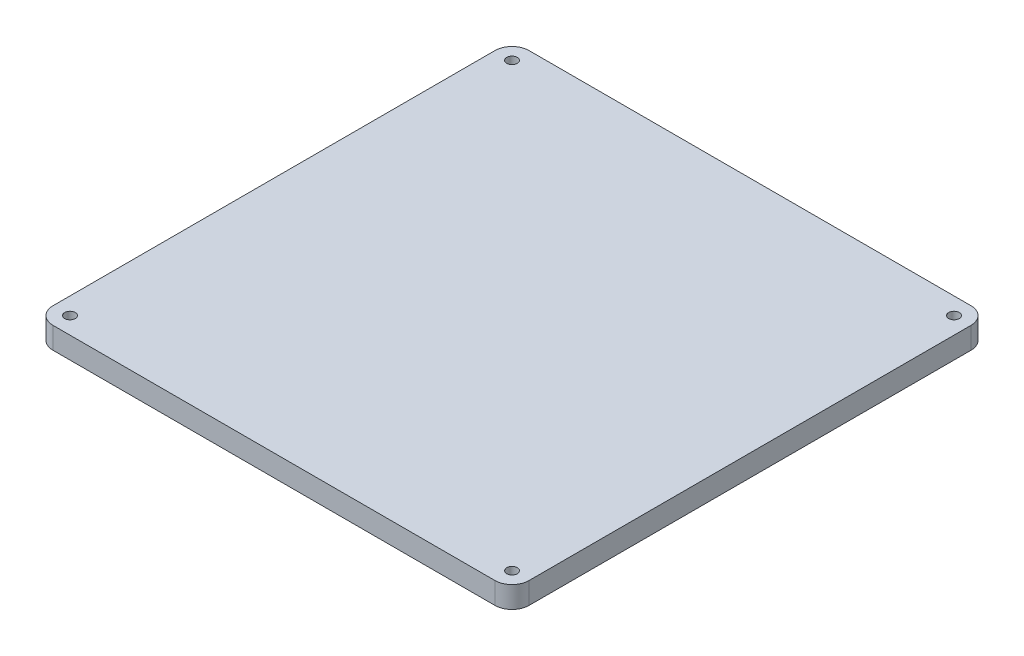
ISO-10303-21;
HEADER;
FILE_DESCRIPTION(('STEP AP214'),'2;1');
FILE_NAME('part.step','',(''),(''),'','','');
FILE_SCHEMA(('AUTOMOTIVE_DESIGN { 1 0 10303 214 1 1 1 1 }'));
ENDSEC;
DATA;
#1=APPLICATION_CONTEXT('core data for automotive mechanical design processes');
#2=APPLICATION_PROTOCOL_DEFINITION('international standard','automotive_design',2000,#1);
#3=PRODUCT_CONTEXT('',#1,'mechanical');
#4=PRODUCT('Part','Part','',(#3));
#5=PRODUCT_RELATED_PRODUCT_CATEGORY('part','',(#4));
#6=PRODUCT_DEFINITION_FORMATION('','',#4);
#7=PRODUCT_DEFINITION_CONTEXT('part definition',#1,'design');
#8=PRODUCT_DEFINITION('design','',#6,#7);
#9=PRODUCT_DEFINITION_SHAPE('','',#8);
#10=(LENGTH_UNIT() NAMED_UNIT(*) SI_UNIT(.MILLI.,.METRE.));
#11=(NAMED_UNIT(*) PLANE_ANGLE_UNIT() SI_UNIT($,.RADIAN.));
#12=(NAMED_UNIT(*) SI_UNIT($,.STERADIAN.) SOLID_ANGLE_UNIT());
#13=UNCERTAINTY_MEASURE_WITH_UNIT(LENGTH_MEASURE(1.E-05),#10,'distance_accuracy_value','');
#14=(GEOMETRIC_REPRESENTATION_CONTEXT(3) GLOBAL_UNCERTAINTY_ASSIGNED_CONTEXT((#13)) GLOBAL_UNIT_ASSIGNED_CONTEXT((#10,
#11,#12)) REPRESENTATION_CONTEXT('',''));
#15=CARTESIAN_POINT('',(0.,0.,0.));
#16=DIRECTION('',(0.,0.,1.));
#17=DIRECTION('',(1.,0.,0.));
#18=AXIS2_PLACEMENT_3D('',#15,#16,#17);
#19=CARTESIAN_POINT('',(-70.,6.35,70.));
#20=DIRECTION('',(1.,0.,0.));
#21=DIRECTION('',(0.,0.,-1.));
#22=AXIS2_PLACEMENT_3D('',#19,#20,#21);
#23=PLANE('',#22);
#24=DIRECTION('',(0.,0.,1.));
#25=VECTOR('',#24,1.);
#26=CARTESIAN_POINT('',(-70.,6.35,70.));
#27=LINE('',#26,#25);
#28=CARTESIAN_POINT('',(-70.,6.35,-65.));
#29=VERTEX_POINT('',#28);
#30=CARTESIAN_POINT('',(-70.,6.35,65.));
#31=VERTEX_POINT('',#30);
#32=EDGE_CURVE('E118',#29,#31,#27,.T.);
#33=ORIENTED_EDGE('',*,*,#32,.F.);
#34=DIRECTION('',(0.,-1.,0.));
#35=VECTOR('',#34,1.);
#36=CARTESIAN_POINT('',(-70.,6.35,-65.));
#37=LINE('',#36,#35);
#38=CARTESIAN_POINT('',(-70.,0.,-65.));
#39=VERTEX_POINT('',#38);
#40=EDGE_CURVE('E103',#29,#39,#37,.T.);
#41=ORIENTED_EDGE('',*,*,#40,.T.);
#42=DIRECTION('',(0.,0.,1.));
#43=VECTOR('',#42,1.);
#44=CARTESIAN_POINT('',(-70.,0.,70.));
#45=LINE('',#44,#43);
#46=CARTESIAN_POINT('',(-70.,0.,65.));
#47=VERTEX_POINT('',#46);
#48=EDGE_CURVE('E115',#39,#47,#45,.T.);
#49=ORIENTED_EDGE('',*,*,#48,.T.);
#50=DIRECTION('',(0.,-1.,0.));
#51=VECTOR('',#50,1.);
#52=CARTESIAN_POINT('',(-70.,6.35,65.));
#53=LINE('',#52,#51);
#54=EDGE_CURVE('E120',#47,#31,#53,.F.);
#55=ORIENTED_EDGE('',*,*,#54,.T.);
#56=EDGE_LOOP('',(#33,#41,#49,#55));
#57=FACE_BOUND('',#56,.T.);
#58=ADVANCED_FACE('F33',(#57),#23,.F.);
#59=CARTESIAN_POINT('',(70.,6.35,70.));
#60=DIRECTION('',(0.,0.,-1.));
#61=DIRECTION('',(-1.,0.,0.));
#62=AXIS2_PLACEMENT_3D('',#59,#60,#61);
#63=PLANE('',#62);
#64=DIRECTION('',(1.,0.,0.));
#65=VECTOR('',#64,1.);
#66=CARTESIAN_POINT('',(70.,0.,70.));
#67=LINE('',#66,#65);
#68=CARTESIAN_POINT('',(-65.,0.,70.));
#69=VERTEX_POINT('',#68);
#70=CARTESIAN_POINT('',(65.,0.,70.));
#71=VERTEX_POINT('',#70);
#72=EDGE_CURVE('E124',#69,#71,#67,.T.);
#73=ORIENTED_EDGE('',*,*,#72,.T.);
#74=DIRECTION('',(0.,-1.,0.));
#75=VECTOR('',#74,1.);
#76=CARTESIAN_POINT('',(65.,6.35,70.));
#77=LINE('',#76,#75);
#78=CARTESIAN_POINT('',(65.,6.35,70.));
#79=VERTEX_POINT('',#78);
#80=EDGE_CURVE('E11',#71,#79,#77,.F.);
#81=ORIENTED_EDGE('',*,*,#80,.T.);
#82=DIRECTION('',(1.,0.,0.));
#83=VECTOR('',#82,1.);
#84=CARTESIAN_POINT('',(70.,6.35,70.));
#85=LINE('',#84,#83);
#86=CARTESIAN_POINT('',(-65.,6.35,70.));
#87=VERTEX_POINT('',#86);
#88=EDGE_CURVE('E164',#87,#79,#85,.T.);
#89=ORIENTED_EDGE('',*,*,#88,.F.);
#90=DIRECTION('',(0.,-1.,0.));
#91=VECTOR('',#90,1.);
#92=CARTESIAN_POINT('',(-65.,6.35,70.));
#93=LINE('',#92,#91);
#94=EDGE_CURVE('E41',#87,#69,#93,.T.);
#95=ORIENTED_EDGE('',*,*,#94,.T.);
#96=EDGE_LOOP('',(#73,#81,#89,#95));
#97=FACE_BOUND('',#96,.T.);
#98=ADVANCED_FACE('F162',(#97),#63,.F.);
#99=CARTESIAN_POINT('',(70.,6.35,70.));
#100=DIRECTION('',(-1.,0.,0.));
#101=DIRECTION('',(0.,0.,1.));
#102=AXIS2_PLACEMENT_3D('',#99,#100,#101);
#103=PLANE('',#102);
#104=DIRECTION('',(0.,0.,-1.));
#105=VECTOR('',#104,1.);
#106=CARTESIAN_POINT('',(70.,0.,70.));
#107=LINE('',#106,#105);
#108=CARTESIAN_POINT('',(70.,0.,65.));
#109=VERTEX_POINT('',#108);
#110=CARTESIAN_POINT('',(70.,0.,-65.));
#111=VERTEX_POINT('',#110);
#112=EDGE_CURVE('E128',#109,#111,#107,.T.);
#113=ORIENTED_EDGE('',*,*,#112,.T.);
#114=DIRECTION('',(0.,-1.,0.));
#115=VECTOR('',#114,1.);
#116=CARTESIAN_POINT('',(70.,6.35,-65.));
#117=LINE('',#116,#115);
#118=CARTESIAN_POINT('',(70.,6.35,-65.));
#119=VERTEX_POINT('',#118);
#120=EDGE_CURVE('E48',#111,#119,#117,.F.);
#121=ORIENTED_EDGE('',*,*,#120,.T.);
#122=DIRECTION('',(0.,0.,-1.));
#123=VECTOR('',#122,1.);
#124=CARTESIAN_POINT('',(70.,6.35,70.));
#125=LINE('',#124,#123);
#126=CARTESIAN_POINT('',(70.,6.35,65.));
#127=VERTEX_POINT('',#126);
#128=EDGE_CURVE('E172',#127,#119,#125,.T.);
#129=ORIENTED_EDGE('',*,*,#128,.F.);
#130=DIRECTION('',(0.,-1.,0.));
#131=VECTOR('',#130,1.);
#132=CARTESIAN_POINT('',(70.,6.35,65.));
#133=LINE('',#132,#131);
#134=EDGE_CURVE('E155',#127,#109,#133,.T.);
#135=ORIENTED_EDGE('',*,*,#134,.T.);
#136=EDGE_LOOP('',(#113,#121,#129,#135));
#137=FACE_BOUND('',#136,.T.);
#138=ADVANCED_FACE('F171',(#137),#103,.F.);
#139=CARTESIAN_POINT('',(70.,6.35,-70.));
#140=DIRECTION('',(0.,0.,1.));
#141=DIRECTION('',(1.,0.,0.));
#142=AXIS2_PLACEMENT_3D('',#139,#140,#141);
#143=PLANE('',#142);
#144=DIRECTION('',(-1.,0.,0.));
#145=VECTOR('',#144,1.);
#146=CARTESIAN_POINT('',(70.,0.,-70.));
#147=LINE('',#146,#145);
#148=CARTESIAN_POINT('',(65.,0.,-70.));
#149=VERTEX_POINT('',#148);
#150=CARTESIAN_POINT('',(-65.,0.,-70.));
#151=VERTEX_POINT('',#150);
#152=EDGE_CURVE('E138',#149,#151,#147,.T.);
#153=ORIENTED_EDGE('',*,*,#152,.T.);
#154=DIRECTION('',(0.,-1.,0.));
#155=VECTOR('',#154,1.);
#156=CARTESIAN_POINT('',(-65.,6.35,-70.));
#157=LINE('',#156,#155);
#158=CARTESIAN_POINT('',(-65.,6.35,-70.));
#159=VERTEX_POINT('',#158);
#160=EDGE_CURVE('E104',#151,#159,#157,.F.);
#161=ORIENTED_EDGE('',*,*,#160,.T.);
#162=DIRECTION('',(-1.,0.,0.));
#163=VECTOR('',#162,1.);
#164=CARTESIAN_POINT('',(70.,6.35,-70.));
#165=LINE('',#164,#163);
#166=CARTESIAN_POINT('',(65.,6.35,-70.));
#167=VERTEX_POINT('',#166);
#168=EDGE_CURVE('E134',#167,#159,#165,.T.);
#169=ORIENTED_EDGE('',*,*,#168,.F.);
#170=DIRECTION('',(0.,-1.,0.));
#171=VECTOR('',#170,1.);
#172=CARTESIAN_POINT('',(65.,6.35,-70.));
#173=LINE('',#172,#171);
#174=EDGE_CURVE('E109',#167,#149,#173,.T.);
#175=ORIENTED_EDGE('',*,*,#174,.T.);
#176=EDGE_LOOP('',(#153,#161,#169,#175));
#177=FACE_BOUND('',#176,.T.);
#178=ADVANCED_FACE('F211',(#177),#143,.F.);
#179=CARTESIAN_POINT('',(0.,6.35,0.));
#180=DIRECTION('',(0.,1.,0.));
#181=DIRECTION('',(0.,0.,1.));
#182=AXIS2_PLACEMENT_3D('',#179,#180,#181);
#183=PLANE('',#182);
#184=CARTESIAN_POINT('',(-65.,6.35,-65.));
#185=DIRECTION('',(0.,1.,0.));
#186=DIRECTION('',(0.,0.,1.));
#187=AXIS2_PLACEMENT_3D('',#184,#185,#186);
#188=CIRCLE('',#187,1.54999999999999);
#189=CARTESIAN_POINT('',(-65.,6.35,-63.45));
#190=VERTEX_POINT('',#189);
#191=EDGE_CURVE('E193',#190,#190,#188,.T.);
#192=ORIENTED_EDGE('',*,*,#191,.F.);
#193=EDGE_LOOP('',(#192));
#194=FACE_BOUND('',#193,.T.);
#195=CARTESIAN_POINT('',(65.,6.35,-65.));
#196=DIRECTION('',(0.,1.,0.));
#197=DIRECTION('',(0.,0.,1.));
#198=AXIS2_PLACEMENT_3D('',#195,#196,#197);
#199=CIRCLE('',#198,1.54999999999999);
#200=CARTESIAN_POINT('',(65.,6.35,-63.45));
#201=VERTEX_POINT('',#200);
#202=EDGE_CURVE('E187',#201,#201,#199,.T.);
#203=ORIENTED_EDGE('',*,*,#202,.F.);
#204=EDGE_LOOP('',(#203));
#205=FACE_BOUND('',#204,.T.);
#206=CARTESIAN_POINT('',(65.,6.35,65.));
#207=DIRECTION('',(0.,1.,0.));
#208=DIRECTION('',(0.,0.,1.));
#209=AXIS2_PLACEMENT_3D('',#206,#207,#208);
#210=CIRCLE('',#209,1.54999999999999);
#211=CARTESIAN_POINT('',(65.,6.35,66.55));
#212=VERTEX_POINT('',#211);
#213=EDGE_CURVE('E181',#212,#212,#210,.T.);
#214=ORIENTED_EDGE('',*,*,#213,.F.);
#215=EDGE_LOOP('',(#214));
#216=FACE_BOUND('',#215,.T.);
#217=CARTESIAN_POINT('',(-65.,6.35,65.));
#218=DIRECTION('',(0.,1.,0.));
#219=DIRECTION('',(0.,0.,1.));
#220=AXIS2_PLACEMENT_3D('',#217,#218,#219);
#221=CIRCLE('',#220,1.54999999999999);
#222=CARTESIAN_POINT('',(-65.,6.35,66.55));
#223=VERTEX_POINT('',#222);
#224=EDGE_CURVE('E131',#223,#223,#221,.T.);
#225=ORIENTED_EDGE('',*,*,#224,.F.);
#226=EDGE_LOOP('',(#225));
#227=FACE_BOUND('',#226,.T.);
#228=ORIENTED_EDGE('',*,*,#168,.T.);
#229=CARTESIAN_POINT('',(-65.,6.35,-65.));
#230=DIRECTION('',(0.,1.,0.));
#231=DIRECTION('',(0.,0.,1.));
#232=AXIS2_PLACEMENT_3D('',#229,#230,#231);
#233=CIRCLE('',#232,5.);
#234=EDGE_CURVE('E153',#159,#29,#233,.T.);
#235=ORIENTED_EDGE('',*,*,#234,.T.);
#236=ORIENTED_EDGE('',*,*,#32,.T.);
#237=CARTESIAN_POINT('',(-65.,6.35,65.));
#238=DIRECTION('',(0.,1.,0.));
#239=DIRECTION('',(0.,0.,1.));
#240=AXIS2_PLACEMENT_3D('',#237,#238,#239);
#241=CIRCLE('',#240,5.);
#242=EDGE_CURVE('E148',#31,#87,#241,.T.);
#243=ORIENTED_EDGE('',*,*,#242,.T.);
#244=ORIENTED_EDGE('',*,*,#88,.T.);
#245=CARTESIAN_POINT('',(65.,6.35,65.));
#246=DIRECTION('',(0.,1.,0.));
#247=DIRECTION('',(0.,0.,1.));
#248=AXIS2_PLACEMENT_3D('',#245,#246,#247);
#249=CIRCLE('',#248,5.);
#250=EDGE_CURVE('E55',#79,#127,#249,.T.);
#251=ORIENTED_EDGE('',*,*,#250,.T.);
#252=ORIENTED_EDGE('',*,*,#128,.T.);
#253=CARTESIAN_POINT('',(65.,6.35,-65.));
#254=DIRECTION('',(0.,1.,0.));
#255=DIRECTION('',(0.,0.,1.));
#256=AXIS2_PLACEMENT_3D('',#253,#254,#255);
#257=CIRCLE('',#256,5.);
#258=EDGE_CURVE('E151',#119,#167,#257,.T.);
#259=ORIENTED_EDGE('',*,*,#258,.T.);
#260=EDGE_LOOP('',(#228,#235,#236,#243,#244,#251,#252,#259));
#261=FACE_BOUND('',#260,.T.);
#262=ADVANCED_FACE('F208',(#194,#205,#216,#227,#261),#183,.T.);
#263=CARTESIAN_POINT('',(0.,0.,0.));
#264=DIRECTION('',(0.,1.,0.));
#265=DIRECTION('',(0.,0.,1.));
#266=AXIS2_PLACEMENT_3D('',#263,#264,#265);
#267=PLANE('',#266);
#268=CARTESIAN_POINT('',(-65.,0.,-65.));
#269=DIRECTION('',(0.,1.,0.));
#270=DIRECTION('',(0.,0.,1.));
#271=AXIS2_PLACEMENT_3D('',#268,#269,#270);
#272=CIRCLE('',#271,1.54999999999999);
#273=CARTESIAN_POINT('',(-65.,0.,-63.45));
#274=VERTEX_POINT('',#273);
#275=EDGE_CURVE('E190',#274,#274,#272,.T.);
#276=ORIENTED_EDGE('',*,*,#275,.T.);
#277=EDGE_LOOP('',(#276));
#278=FACE_BOUND('',#277,.T.);
#279=CARTESIAN_POINT('',(65.,0.,-65.));
#280=DIRECTION('',(0.,1.,0.));
#281=DIRECTION('',(0.,0.,1.));
#282=AXIS2_PLACEMENT_3D('',#279,#280,#281);
#283=CIRCLE('',#282,1.54999999999999);
#284=CARTESIAN_POINT('',(65.,0.,-63.45));
#285=VERTEX_POINT('',#284);
#286=EDGE_CURVE('E184',#285,#285,#283,.T.);
#287=ORIENTED_EDGE('',*,*,#286,.T.);
#288=EDGE_LOOP('',(#287));
#289=FACE_BOUND('',#288,.T.);
#290=CARTESIAN_POINT('',(65.,0.,65.));
#291=DIRECTION('',(0.,1.,0.));
#292=DIRECTION('',(0.,0.,1.));
#293=AXIS2_PLACEMENT_3D('',#290,#291,#292);
#294=CIRCLE('',#293,1.54999999999999);
#295=CARTESIAN_POINT('',(65.,0.,66.55));
#296=VERTEX_POINT('',#295);
#297=EDGE_CURVE('E179',#296,#296,#294,.T.);
#298=ORIENTED_EDGE('',*,*,#297,.T.);
#299=EDGE_LOOP('',(#298));
#300=FACE_BOUND('',#299,.T.);
#301=CARTESIAN_POINT('',(-65.,0.,65.));
#302=DIRECTION('',(0.,1.,0.));
#303=DIRECTION('',(0.,0.,1.));
#304=AXIS2_PLACEMENT_3D('',#301,#302,#303);
#305=CIRCLE('',#304,1.54999999999999);
#306=CARTESIAN_POINT('',(-65.,0.,66.55));
#307=VERTEX_POINT('',#306);
#308=EDGE_CURVE('E125',#307,#307,#305,.T.);
#309=ORIENTED_EDGE('',*,*,#308,.T.);
#310=EDGE_LOOP('',(#309));
#311=FACE_BOUND('',#310,.T.);
#312=ORIENTED_EDGE('',*,*,#48,.F.);
#313=CARTESIAN_POINT('',(-65.,0.,-65.));
#314=DIRECTION('',(0.,1.,0.));
#315=DIRECTION('',(0.,0.,1.));
#316=AXIS2_PLACEMENT_3D('',#313,#314,#315);
#317=CIRCLE('',#316,5.);
#318=EDGE_CURVE('E99',#39,#151,#317,.F.);
#319=ORIENTED_EDGE('',*,*,#318,.T.);
#320=ORIENTED_EDGE('',*,*,#152,.F.);
#321=CARTESIAN_POINT('',(65.,0.,-65.));
#322=DIRECTION('',(0.,1.,0.));
#323=DIRECTION('',(0.,0.,1.));
#324=AXIS2_PLACEMENT_3D('',#321,#322,#323);
#325=CIRCLE('',#324,5.);
#326=EDGE_CURVE('E110',#149,#111,#325,.F.);
#327=ORIENTED_EDGE('',*,*,#326,.T.);
#328=ORIENTED_EDGE('',*,*,#112,.F.);
#329=CARTESIAN_POINT('',(65.,0.,65.));
#330=DIRECTION('',(0.,1.,0.));
#331=DIRECTION('',(0.,0.,1.));
#332=AXIS2_PLACEMENT_3D('',#329,#330,#331);
#333=CIRCLE('',#332,5.);
#334=EDGE_CURVE('E142',#109,#71,#333,.F.);
#335=ORIENTED_EDGE('',*,*,#334,.T.);
#336=ORIENTED_EDGE('',*,*,#72,.F.);
#337=CARTESIAN_POINT('',(-65.,0.,65.));
#338=DIRECTION('',(0.,1.,0.));
#339=DIRECTION('',(0.,0.,1.));
#340=AXIS2_PLACEMENT_3D('',#337,#338,#339);
#341=CIRCLE('',#340,5.);
#342=EDGE_CURVE('E119',#69,#47,#341,.F.);
#343=ORIENTED_EDGE('',*,*,#342,.T.);
#344=EDGE_LOOP('',(#312,#319,#320,#327,#328,#335,#336,#343));
#345=FACE_BOUND('',#344,.T.);
#346=ADVANCED_FACE('F122',(#278,#289,#300,#311,#345),#267,.F.);
#347=CARTESIAN_POINT('',(-65.,6.35,-65.));
#348=DIRECTION('',(0.,-1.,0.));
#349=DIRECTION('',(0.,0.,-1.));
#350=AXIS2_PLACEMENT_3D('',#347,#348,#349);
#351=CYLINDRICAL_SURFACE('',#350,5.);
#352=ORIENTED_EDGE('',*,*,#234,.F.);
#353=ORIENTED_EDGE('',*,*,#160,.F.);
#354=ORIENTED_EDGE('',*,*,#318,.F.);
#355=ORIENTED_EDGE('',*,*,#40,.F.);
#356=EDGE_LOOP('',(#352,#353,#354,#355));
#357=FACE_BOUND('',#356,.T.);
#358=ADVANCED_FACE('F102',(#357),#351,.T.);
#359=CARTESIAN_POINT('',(65.,6.35,-65.));
#360=DIRECTION('',(0.,-1.,0.));
#361=DIRECTION('',(0.,0.,-1.));
#362=AXIS2_PLACEMENT_3D('',#359,#360,#361);
#363=CYLINDRICAL_SURFACE('',#362,5.);
#364=ORIENTED_EDGE('',*,*,#258,.F.);
#365=ORIENTED_EDGE('',*,*,#120,.F.);
#366=ORIENTED_EDGE('',*,*,#326,.F.);
#367=ORIENTED_EDGE('',*,*,#174,.F.);
#368=EDGE_LOOP('',(#364,#365,#366,#367));
#369=FACE_BOUND('',#368,.T.);
#370=ADVANCED_FACE('F222',(#369),#363,.T.);
#371=CARTESIAN_POINT('',(65.,6.35,65.));
#372=DIRECTION('',(0.,-1.,0.));
#373=DIRECTION('',(0.,0.,-1.));
#374=AXIS2_PLACEMENT_3D('',#371,#372,#373);
#375=CYLINDRICAL_SURFACE('',#374,5.);
#376=ORIENTED_EDGE('',*,*,#250,.F.);
#377=ORIENTED_EDGE('',*,*,#80,.F.);
#378=ORIENTED_EDGE('',*,*,#334,.F.);
#379=ORIENTED_EDGE('',*,*,#134,.F.);
#380=EDGE_LOOP('',(#376,#377,#378,#379));
#381=FACE_BOUND('',#380,.T.);
#382=ADVANCED_FACE('F170',(#381),#375,.T.);
#383=CARTESIAN_POINT('',(-65.,6.35,65.));
#384=DIRECTION('',(0.,-1.,0.));
#385=DIRECTION('',(0.,0.,-1.));
#386=AXIS2_PLACEMENT_3D('',#383,#384,#385);
#387=CYLINDRICAL_SURFACE('',#386,5.);
#388=ORIENTED_EDGE('',*,*,#242,.F.);
#389=ORIENTED_EDGE('',*,*,#54,.F.);
#390=ORIENTED_EDGE('',*,*,#342,.F.);
#391=ORIENTED_EDGE('',*,*,#94,.F.);
#392=EDGE_LOOP('',(#388,#389,#390,#391));
#393=FACE_BOUND('',#392,.T.);
#394=ADVANCED_FACE('F35',(#393),#387,.T.);
#395=CARTESIAN_POINT('',(-65.,0.,65.));
#396=DIRECTION('',(0.,1.,0.));
#397=DIRECTION('',(0.,0.,1.));
#398=AXIS2_PLACEMENT_3D('',#395,#396,#397);
#399=CYLINDRICAL_SURFACE('',#398,1.54999999999999);
#400=ORIENTED_EDGE('',*,*,#308,.F.);
#401=EDGE_LOOP('',(#400));
#402=FACE_BOUND('',#401,.T.);
#403=ORIENTED_EDGE('',*,*,#224,.T.);
#404=EDGE_LOOP('',(#403));
#405=FACE_BOUND('',#404,.T.);
#406=ADVANCED_FACE('F243',(#402,#405),#399,.F.);
#407=CARTESIAN_POINT('',(65.,0.,65.));
#408=DIRECTION('',(0.,1.,0.));
#409=DIRECTION('',(0.,0.,1.));
#410=AXIS2_PLACEMENT_3D('',#407,#408,#409);
#411=CYLINDRICAL_SURFACE('',#410,1.54999999999999);
#412=ORIENTED_EDGE('',*,*,#297,.F.);
#413=EDGE_LOOP('',(#412));
#414=FACE_BOUND('',#413,.T.);
#415=ORIENTED_EDGE('',*,*,#213,.T.);
#416=EDGE_LOOP('',(#415));
#417=FACE_BOUND('',#416,.T.);
#418=ADVANCED_FACE('F246',(#414,#417),#411,.F.);
#419=CARTESIAN_POINT('',(65.,0.,-65.));
#420=DIRECTION('',(0.,1.,0.));
#421=DIRECTION('',(0.,0.,1.));
#422=AXIS2_PLACEMENT_3D('',#419,#420,#421);
#423=CYLINDRICAL_SURFACE('',#422,1.54999999999999);
#424=ORIENTED_EDGE('',*,*,#286,.F.);
#425=EDGE_LOOP('',(#424));
#426=FACE_BOUND('',#425,.T.);
#427=ORIENTED_EDGE('',*,*,#202,.T.);
#428=EDGE_LOOP('',(#427));
#429=FACE_BOUND('',#428,.T.);
#430=ADVANCED_FACE('F204',(#426,#429),#423,.F.);
#431=CARTESIAN_POINT('',(-65.,0.,-65.));
#432=DIRECTION('',(0.,1.,0.));
#433=DIRECTION('',(0.,0.,1.));
#434=AXIS2_PLACEMENT_3D('',#431,#432,#433);
#435=CYLINDRICAL_SURFACE('',#434,1.54999999999999);
#436=ORIENTED_EDGE('',*,*,#275,.F.);
#437=EDGE_LOOP('',(#436));
#438=FACE_BOUND('',#437,.T.);
#439=ORIENTED_EDGE('',*,*,#191,.T.);
#440=EDGE_LOOP('',(#439));
#441=FACE_BOUND('',#440,.T.);
#442=ADVANCED_FACE('F201',(#438,#441),#435,.F.);
#443=CLOSED_SHELL('',(#58,#98,#138,#178,#262,#346,#358,#370,#382,#394,#406,#418,#430,#442));
#444=MANIFOLD_SOLID_BREP('B2',#443);
#445=ADVANCED_BREP_SHAPE_REPRESENTATION('',(#18,#444),#14);
#446=SHAPE_DEFINITION_REPRESENTATION(#9,#445);
ENDSEC;
END-ISO-10303-21;
